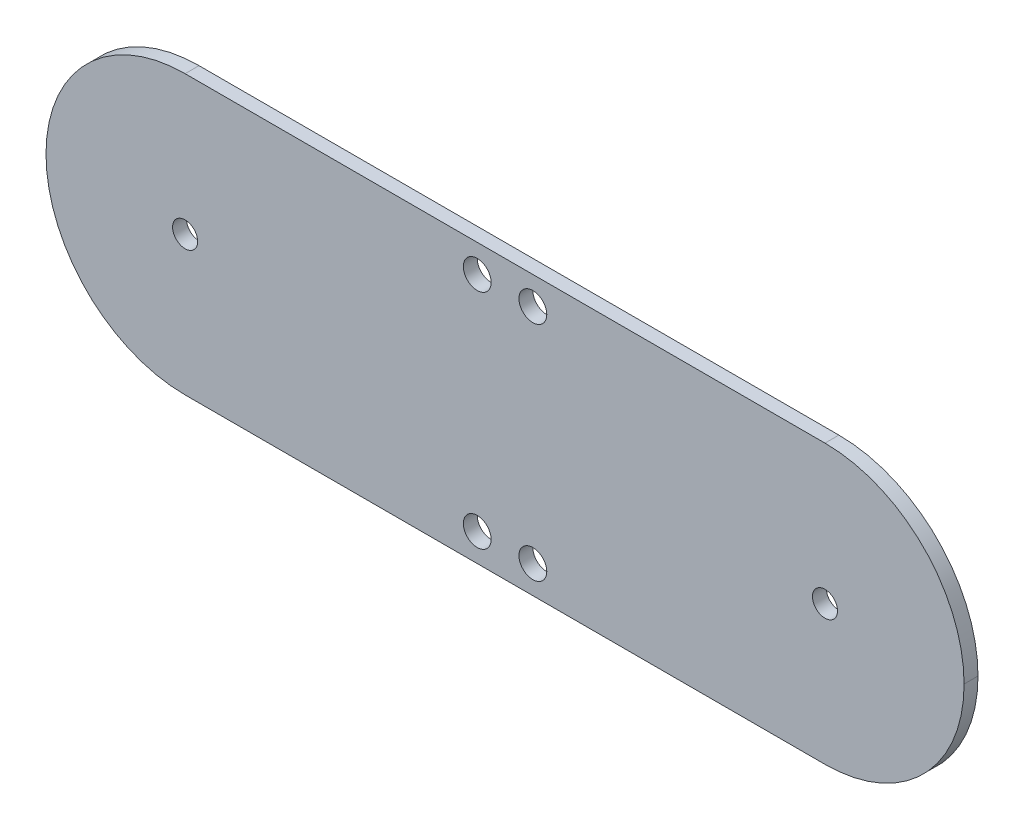
ISO-10303-21;
HEADER;
FILE_DESCRIPTION(('STEP AP214'),'2;1');
FILE_NAME('part.step','',(''),(''),'','','');
FILE_SCHEMA(('AUTOMOTIVE_DESIGN { 1 0 10303 214 1 1 1 1 }'));
ENDSEC;
DATA;
#1=APPLICATION_CONTEXT('core data for automotive mechanical design processes');
#2=APPLICATION_PROTOCOL_DEFINITION('international standard','automotive_design',2000,#1);
#3=PRODUCT_CONTEXT('',#1,'mechanical');
#4=PRODUCT('Part','Part','',(#3));
#5=PRODUCT_RELATED_PRODUCT_CATEGORY('part','',(#4));
#6=PRODUCT_DEFINITION_FORMATION('','',#4);
#7=PRODUCT_DEFINITION_CONTEXT('part definition',#1,'design');
#8=PRODUCT_DEFINITION('design','',#6,#7);
#9=PRODUCT_DEFINITION_SHAPE('','',#8);
#10=(LENGTH_UNIT() NAMED_UNIT(*) SI_UNIT(.MILLI.,.METRE.));
#11=(NAMED_UNIT(*) PLANE_ANGLE_UNIT() SI_UNIT($,.RADIAN.));
#12=(NAMED_UNIT(*) SI_UNIT($,.STERADIAN.) SOLID_ANGLE_UNIT());
#13=UNCERTAINTY_MEASURE_WITH_UNIT(LENGTH_MEASURE(1.E-05),#10,'distance_accuracy_value','');
#14=(GEOMETRIC_REPRESENTATION_CONTEXT(3) GLOBAL_UNCERTAINTY_ASSIGNED_CONTEXT((#13)) GLOBAL_UNIT_ASSIGNED_CONTEXT((#10,
#11,#12)) REPRESENTATION_CONTEXT('',''));
#15=CARTESIAN_POINT('',(0.,0.,0.));
#16=DIRECTION('',(0.,0.,1.));
#17=DIRECTION('',(1.,0.,0.));
#18=AXIS2_PLACEMENT_3D('',#15,#16,#17);
#19=CARTESIAN_POINT('',(82.5,-25.,2.5));
#20=DIRECTION('',(0.,1.,0.));
#21=DIRECTION('',(-1.,0.,0.));
#22=AXIS2_PLACEMENT_3D('',#19,#20,#21);
#23=PLANE('',#22);
#24=DIRECTION('',(1.,0.,0.));
#25=VECTOR('',#24,1.);
#26=CARTESIAN_POINT('',(82.5,-25.,2.5));
#27=LINE('',#26,#25);
#28=CARTESIAN_POINT('',(-57.5,-25.,2.5));
#29=VERTEX_POINT('',#28);
#30=CARTESIAN_POINT('',(57.5,-25.,2.5));
#31=VERTEX_POINT('',#30);
#32=EDGE_CURVE('E116',#29,#31,#27,.T.);
#33=ORIENTED_EDGE('',*,*,#32,.F.);
#34=DIRECTION('',(0.,0.,-1.));
#35=VECTOR('',#34,1.);
#36=CARTESIAN_POINT('',(-57.5,-25.,2.5));
#37=LINE('',#36,#35);
#38=CARTESIAN_POINT('',(-57.5,-25.,0.));
#39=VERTEX_POINT('',#38);
#40=EDGE_CURVE('E100',#29,#39,#37,.T.);
#41=ORIENTED_EDGE('',*,*,#40,.T.);
#42=DIRECTION('',(1.,0.,0.));
#43=VECTOR('',#42,1.);
#44=CARTESIAN_POINT('',(82.5,-25.,0.));
#45=LINE('',#44,#43);
#46=CARTESIAN_POINT('',(57.5,-25.,0.));
#47=VERTEX_POINT('',#46);
#48=EDGE_CURVE('E113',#39,#47,#45,.T.);
#49=ORIENTED_EDGE('',*,*,#48,.T.);
#50=DIRECTION('',(0.,0.,-1.));
#51=VECTOR('',#50,1.);
#52=CARTESIAN_POINT('',(57.5,-25.,2.5));
#53=LINE('',#52,#51);
#54=EDGE_CURVE('E119',#47,#31,#53,.F.);
#55=ORIENTED_EDGE('',*,*,#54,.T.);
#56=EDGE_LOOP('',(#33,#41,#49,#55));
#57=FACE_BOUND('',#56,.T.);
#58=ADVANCED_FACE('F41',(#57),#23,.F.);
#59=CARTESIAN_POINT('',(82.5,25.,2.5));
#60=DIRECTION('',(0.,-1.,0.));
#61=DIRECTION('',(1.,0.,0.));
#62=AXIS2_PLACEMENT_3D('',#59,#60,#61);
#63=PLANE('',#62);
#64=DIRECTION('',(-1.,0.,0.));
#65=VECTOR('',#64,1.);
#66=CARTESIAN_POINT('',(82.5,25.,0.));
#67=LINE('',#66,#65);
#68=CARTESIAN_POINT('',(57.5,25.,0.));
#69=VERTEX_POINT('',#68);
#70=CARTESIAN_POINT('',(-57.5,25.,0.));
#71=VERTEX_POINT('',#70);
#72=EDGE_CURVE('E125',#69,#71,#67,.T.);
#73=ORIENTED_EDGE('',*,*,#72,.T.);
#74=DIRECTION('',(0.,0.,-1.));
#75=VECTOR('',#74,1.);
#76=CARTESIAN_POINT('',(-57.5,25.,2.5));
#77=LINE('',#76,#75);
#78=CARTESIAN_POINT('',(-57.5,25.,2.5));
#79=VERTEX_POINT('',#78);
#80=EDGE_CURVE('E12',#71,#79,#77,.F.);
#81=ORIENTED_EDGE('',*,*,#80,.T.);
#82=DIRECTION('',(-1.,0.,0.));
#83=VECTOR('',#82,1.);
#84=CARTESIAN_POINT('',(82.5,25.,2.5));
#85=LINE('',#84,#83);
#86=CARTESIAN_POINT('',(57.5,25.,2.5));
#87=VERTEX_POINT('',#86);
#88=EDGE_CURVE('E133',#87,#79,#85,.T.);
#89=ORIENTED_EDGE('',*,*,#88,.F.);
#90=DIRECTION('',(0.,0.,-1.));
#91=VECTOR('',#90,1.);
#92=CARTESIAN_POINT('',(57.5,25.,2.5));
#93=LINE('',#92,#91);
#94=EDGE_CURVE('E51',#87,#69,#93,.T.);
#95=ORIENTED_EDGE('',*,*,#94,.T.);
#96=EDGE_LOOP('',(#73,#81,#89,#95));
#97=FACE_BOUND('',#96,.T.);
#98=ADVANCED_FACE('F215',(#97),#63,.F.);
#99=CARTESIAN_POINT('',(0.,0.,2.5));
#100=DIRECTION('',(0.,0.,-1.));
#101=DIRECTION('',(-1.,0.,0.));
#102=AXIS2_PLACEMENT_3D('',#99,#100,#101);
#103=PLANE('',#102);
#104=CARTESIAN_POINT('',(57.5,0.,2.5));
#105=DIRECTION('',(0.,0.,-1.));
#106=DIRECTION('',(-1.,0.,0.));
#107=AXIS2_PLACEMENT_3D('',#104,#105,#106);
#108=CIRCLE('',#107,2.25);
#109=CARTESIAN_POINT('',(55.25,0.,2.5));
#110=VERTEX_POINT('',#109);
#111=EDGE_CURVE('E178',#110,#110,#108,.T.);
#112=ORIENTED_EDGE('',*,*,#111,.T.);
#113=EDGE_LOOP('',(#112));
#114=FACE_BOUND('',#113,.T.);
#115=CARTESIAN_POINT('',(-57.5,0.,2.5));
#116=DIRECTION('',(0.,0.,1.));
#117=DIRECTION('',(1.,0.,0.));
#118=AXIS2_PLACEMENT_3D('',#115,#116,#117);
#119=CIRCLE('',#118,2.25);
#120=CARTESIAN_POINT('',(-55.25,0.,2.5));
#121=VERTEX_POINT('',#120);
#122=EDGE_CURVE('E164',#121,#121,#119,.T.);
#123=ORIENTED_EDGE('',*,*,#122,.F.);
#124=EDGE_LOOP('',(#123));
#125=FACE_BOUND('',#124,.T.);
#126=CARTESIAN_POINT('',(-5.,-20.,2.5));
#127=DIRECTION('',(0.,0.,-1.));
#128=DIRECTION('',(1.,0.,0.));
#129=AXIS2_PLACEMENT_3D('',#126,#127,#128);
#130=CIRCLE('',#129,2.5);
#131=CARTESIAN_POINT('',(-2.5,-20.,2.5));
#132=VERTEX_POINT('',#131);
#133=EDGE_CURVE('E186',#132,#132,#130,.T.);
#134=ORIENTED_EDGE('',*,*,#133,.T.);
#135=EDGE_LOOP('',(#134));
#136=FACE_BOUND('',#135,.T.);
#137=CARTESIAN_POINT('',(5.,-20.,2.5));
#138=DIRECTION('',(0.,0.,-1.));
#139=DIRECTION('',(1.,0.,0.));
#140=AXIS2_PLACEMENT_3D('',#137,#138,#139);
#141=CIRCLE('',#140,2.5);
#142=CARTESIAN_POINT('',(7.5,-20.,2.5));
#143=VERTEX_POINT('',#142);
#144=EDGE_CURVE('E163',#143,#143,#141,.T.);
#145=ORIENTED_EDGE('',*,*,#144,.T.);
#146=EDGE_LOOP('',(#145));
#147=FACE_BOUND('',#146,.T.);
#148=CARTESIAN_POINT('',(-5.,20.,2.5));
#149=DIRECTION('',(0.,0.,1.));
#150=DIRECTION('',(1.,0.,0.));
#151=AXIS2_PLACEMENT_3D('',#148,#149,#150);
#152=CIRCLE('',#151,2.5);
#153=CARTESIAN_POINT('',(-2.5,20.,2.5));
#154=VERTEX_POINT('',#153);
#155=EDGE_CURVE('E196',#154,#154,#152,.T.);
#156=ORIENTED_EDGE('',*,*,#155,.F.);
#157=EDGE_LOOP('',(#156));
#158=FACE_BOUND('',#157,.T.);
#159=CARTESIAN_POINT('',(5.,20.,2.5));
#160=DIRECTION('',(0.,0.,1.));
#161=DIRECTION('',(1.,0.,0.));
#162=AXIS2_PLACEMENT_3D('',#159,#160,#161);
#163=CIRCLE('',#162,2.5);
#164=CARTESIAN_POINT('',(7.5,20.,2.5));
#165=VERTEX_POINT('',#164);
#166=EDGE_CURVE('E185',#165,#165,#163,.T.);
#167=ORIENTED_EDGE('',*,*,#166,.F.);
#168=EDGE_LOOP('',(#167));
#169=FACE_BOUND('',#168,.T.);
#170=CARTESIAN_POINT('',(-57.5,0.,2.5));
#171=DIRECTION('',(0.,0.,-1.));
#172=DIRECTION('',(-1.,0.,0.));
#173=AXIS2_PLACEMENT_3D('',#170,#171,#172);
#174=CIRCLE('',#173,25.);
#175=CARTESIAN_POINT('',(-82.5,0.,2.5));
#176=VERTEX_POINT('',#175);
#177=EDGE_CURVE('E149',#79,#176,#174,.F.);
#178=ORIENTED_EDGE('',*,*,#177,.T.);
#179=CARTESIAN_POINT('',(-57.5,0.,2.5));
#180=DIRECTION('',(0.,0.,-1.));
#181=DIRECTION('',(-1.,0.,0.));
#182=AXIS2_PLACEMENT_3D('',#179,#180,#181);
#183=CIRCLE('',#182,25.);
#184=EDGE_CURVE('E152',#176,#29,#183,.F.);
#185=ORIENTED_EDGE('',*,*,#184,.T.);
#186=ORIENTED_EDGE('',*,*,#32,.T.);
#187=CARTESIAN_POINT('',(57.5,0.,2.5));
#188=DIRECTION('',(0.,0.,-1.));
#189=DIRECTION('',(-1.,0.,0.));
#190=AXIS2_PLACEMENT_3D('',#187,#188,#189);
#191=CIRCLE('',#190,25.);
#192=CARTESIAN_POINT('',(82.5,0.,2.5));
#193=VERTEX_POINT('',#192);
#194=EDGE_CURVE('E146',#31,#193,#191,.F.);
#195=ORIENTED_EDGE('',*,*,#194,.T.);
#196=CARTESIAN_POINT('',(57.5,0.,2.5));
#197=DIRECTION('',(0.,0.,-1.));
#198=DIRECTION('',(-1.,0.,0.));
#199=AXIS2_PLACEMENT_3D('',#196,#197,#198);
#200=CIRCLE('',#199,25.);
#201=EDGE_CURVE('E64',#193,#87,#200,.F.);
#202=ORIENTED_EDGE('',*,*,#201,.T.);
#203=ORIENTED_EDGE('',*,*,#88,.T.);
#204=EDGE_LOOP('',(#178,#185,#186,#195,#202,#203));
#205=FACE_BOUND('',#204,.T.);
#206=ADVANCED_FACE('F209',(#114,#125,#136,#147,#158,#169,#205),#103,.F.);
#207=CARTESIAN_POINT('',(0.,0.,0.));
#208=DIRECTION('',(0.,0.,-1.));
#209=DIRECTION('',(-1.,0.,0.));
#210=AXIS2_PLACEMENT_3D('',#207,#208,#209);
#211=PLANE('',#210);
#212=CARTESIAN_POINT('',(57.5,0.,0.));
#213=DIRECTION('',(0.,0.,-1.));
#214=DIRECTION('',(-1.,0.,0.));
#215=AXIS2_PLACEMENT_3D('',#212,#213,#214);
#216=CIRCLE('',#215,2.25);
#217=CARTESIAN_POINT('',(55.25,0.,0.));
#218=VERTEX_POINT('',#217);
#219=EDGE_CURVE('E45',#218,#218,#216,.F.);
#220=ORIENTED_EDGE('',*,*,#219,.T.);
#221=EDGE_LOOP('',(#220));
#222=FACE_BOUND('',#221,.T.);
#223=CARTESIAN_POINT('',(-57.5,0.,0.));
#224=DIRECTION('',(0.,0.,-1.));
#225=DIRECTION('',(-1.,0.,0.));
#226=AXIS2_PLACEMENT_3D('',#223,#224,#225);
#227=CIRCLE('',#226,2.25);
#228=CARTESIAN_POINT('',(-59.75,0.,0.));
#229=VERTEX_POINT('',#228);
#230=EDGE_CURVE('E160',#229,#229,#227,.T.);
#231=ORIENTED_EDGE('',*,*,#230,.F.);
#232=EDGE_LOOP('',(#231));
#233=FACE_BOUND('',#232,.T.);
#234=CARTESIAN_POINT('',(-5.,-20.,0.));
#235=DIRECTION('',(0.,0.,-1.));
#236=DIRECTION('',(1.,0.,0.));
#237=AXIS2_PLACEMENT_3D('',#234,#235,#236);
#238=CIRCLE('',#237,2.5);
#239=CARTESIAN_POINT('',(-2.5,-20.,0.));
#240=VERTEX_POINT('',#239);
#241=EDGE_CURVE('E181',#240,#240,#238,.T.);
#242=ORIENTED_EDGE('',*,*,#241,.F.);
#243=EDGE_LOOP('',(#242));
#244=FACE_BOUND('',#243,.T.);
#245=CARTESIAN_POINT('',(5.,-20.,0.));
#246=DIRECTION('',(0.,0.,-1.));
#247=DIRECTION('',(1.,0.,0.));
#248=AXIS2_PLACEMENT_3D('',#245,#246,#247);
#249=CIRCLE('',#248,2.5);
#250=CARTESIAN_POINT('',(7.5,-20.,0.));
#251=VERTEX_POINT('',#250);
#252=EDGE_CURVE('E170',#251,#251,#249,.T.);
#253=ORIENTED_EDGE('',*,*,#252,.F.);
#254=EDGE_LOOP('',(#253));
#255=FACE_BOUND('',#254,.T.);
#256=CARTESIAN_POINT('',(-5.,20.,0.));
#257=DIRECTION('',(0.,0.,1.));
#258=DIRECTION('',(1.,0.,0.));
#259=AXIS2_PLACEMENT_3D('',#256,#257,#258);
#260=CIRCLE('',#259,2.5);
#261=CARTESIAN_POINT('',(-2.5,20.,0.));
#262=VERTEX_POINT('',#261);
#263=EDGE_CURVE('E159',#262,#262,#260,.T.);
#264=ORIENTED_EDGE('',*,*,#263,.T.);
#265=EDGE_LOOP('',(#264));
#266=FACE_BOUND('',#265,.T.);
#267=CARTESIAN_POINT('',(5.,20.,0.));
#268=DIRECTION('',(0.,0.,1.));
#269=DIRECTION('',(1.,0.,0.));
#270=AXIS2_PLACEMENT_3D('',#267,#268,#269);
#271=CIRCLE('',#270,2.5);
#272=CARTESIAN_POINT('',(7.5,20.,0.));
#273=VERTEX_POINT('',#272);
#274=EDGE_CURVE('E200',#273,#273,#271,.T.);
#275=ORIENTED_EDGE('',*,*,#274,.T.);
#276=EDGE_LOOP('',(#275));
#277=FACE_BOUND('',#276,.T.);
#278=ORIENTED_EDGE('',*,*,#48,.F.);
#279=CARTESIAN_POINT('',(-57.5,0.,0.));
#280=DIRECTION('',(0.,0.,-1.));
#281=DIRECTION('',(-1.,0.,0.));
#282=AXIS2_PLACEMENT_3D('',#279,#280,#281);
#283=CIRCLE('',#282,25.);
#284=CARTESIAN_POINT('',(-82.5,0.,0.));
#285=VERTEX_POINT('',#284);
#286=EDGE_CURVE('E96',#39,#285,#283,.T.);
#287=ORIENTED_EDGE('',*,*,#286,.T.);
#288=CARTESIAN_POINT('',(-57.5,0.,0.));
#289=DIRECTION('',(0.,0.,-1.));
#290=DIRECTION('',(-1.,0.,0.));
#291=AXIS2_PLACEMENT_3D('',#288,#289,#290);
#292=CIRCLE('',#291,25.);
#293=EDGE_CURVE('E107',#285,#71,#292,.T.);
#294=ORIENTED_EDGE('',*,*,#293,.T.);
#295=ORIENTED_EDGE('',*,*,#72,.F.);
#296=CARTESIAN_POINT('',(57.5,0.,0.));
#297=DIRECTION('',(0.,0.,-1.));
#298=DIRECTION('',(-1.,0.,0.));
#299=AXIS2_PLACEMENT_3D('',#296,#297,#298);
#300=CIRCLE('',#299,25.);
#301=CARTESIAN_POINT('',(82.5,0.,0.));
#302=VERTEX_POINT('',#301);
#303=EDGE_CURVE('E118',#69,#302,#300,.T.);
#304=ORIENTED_EDGE('',*,*,#303,.T.);
#305=CARTESIAN_POINT('',(57.5,0.,0.));
#306=DIRECTION('',(0.,0.,-1.));
#307=DIRECTION('',(-1.,0.,0.));
#308=AXIS2_PLACEMENT_3D('',#305,#306,#307);
#309=CIRCLE('',#308,25.);
#310=EDGE_CURVE('E123',#302,#47,#309,.T.);
#311=ORIENTED_EDGE('',*,*,#310,.T.);
#312=EDGE_LOOP('',(#278,#287,#294,#295,#304,#311));
#313=FACE_BOUND('',#312,.T.);
#314=ADVANCED_FACE('F121',(#222,#233,#244,#255,#266,#277,#313),#211,.T.);
#315=CARTESIAN_POINT('',(-57.5,0.,2.5));
#316=DIRECTION('',(0.,0.,-1.));
#317=DIRECTION('',(-1.,0.,0.));
#318=AXIS2_PLACEMENT_3D('',#315,#316,#317);
#319=CYLINDRICAL_SURFACE('',#318,25.);
#320=DIRECTION('',(0.,0.,-1.));
#321=VECTOR('',#320,1.);
#322=CARTESIAN_POINT('',(-82.5,0.,2.5));
#323=LINE('',#322,#321);
#324=EDGE_CURVE('E102',#176,#285,#323,.T.);
#325=ORIENTED_EDGE('',*,*,#324,.F.);
#326=ORIENTED_EDGE('',*,*,#177,.F.);
#327=ORIENTED_EDGE('',*,*,#80,.F.);
#328=ORIENTED_EDGE('',*,*,#293,.F.);
#329=EDGE_LOOP('',(#325,#326,#327,#328));
#330=FACE_BOUND('',#329,.T.);
#331=ADVANCED_FACE('F212',(#330),#319,.T.);
#332=CARTESIAN_POINT('',(-57.5,0.,2.5));
#333=DIRECTION('',(0.,0.,-1.));
#334=DIRECTION('',(-1.,0.,0.));
#335=AXIS2_PLACEMENT_3D('',#332,#333,#334);
#336=CYLINDRICAL_SURFACE('',#335,25.);
#337=ORIENTED_EDGE('',*,*,#184,.F.);
#338=ORIENTED_EDGE('',*,*,#324,.T.);
#339=ORIENTED_EDGE('',*,*,#286,.F.);
#340=ORIENTED_EDGE('',*,*,#40,.F.);
#341=EDGE_LOOP('',(#337,#338,#339,#340));
#342=FACE_BOUND('',#341,.T.);
#343=ADVANCED_FACE('F99',(#342),#336,.T.);
#344=CARTESIAN_POINT('',(57.5,0.,2.5));
#345=DIRECTION('',(0.,0.,-1.));
#346=DIRECTION('',(-1.,0.,0.));
#347=AXIS2_PLACEMENT_3D('',#344,#345,#346);
#348=CYLINDRICAL_SURFACE('',#347,25.);
#349=ORIENTED_EDGE('',*,*,#94,.F.);
#350=ORIENTED_EDGE('',*,*,#201,.F.);
#351=DIRECTION('',(0.,0.,-1.));
#352=VECTOR('',#351,1.);
#353=CARTESIAN_POINT('',(82.5,0.,2.5));
#354=LINE('',#353,#352);
#355=EDGE_CURVE('E130',#302,#193,#354,.F.);
#356=ORIENTED_EDGE('',*,*,#355,.F.);
#357=ORIENTED_EDGE('',*,*,#303,.F.);
#358=EDGE_LOOP('',(#349,#350,#356,#357));
#359=FACE_BOUND('',#358,.T.);
#360=ADVANCED_FACE('F43',(#359),#348,.T.);
#361=CARTESIAN_POINT('',(57.5,0.,2.5));
#362=DIRECTION('',(0.,0.,-1.));
#363=DIRECTION('',(-1.,0.,0.));
#364=AXIS2_PLACEMENT_3D('',#361,#362,#363);
#365=CYLINDRICAL_SURFACE('',#364,25.);
#366=ORIENTED_EDGE('',*,*,#194,.F.);
#367=ORIENTED_EDGE('',*,*,#54,.F.);
#368=ORIENTED_EDGE('',*,*,#310,.F.);
#369=ORIENTED_EDGE('',*,*,#355,.T.);
#370=EDGE_LOOP('',(#366,#367,#368,#369));
#371=FACE_BOUND('',#370,.T.);
#372=ADVANCED_FACE('F219',(#371),#365,.T.);
#373=CARTESIAN_POINT('',(5.,20.,0.));
#374=DIRECTION('',(0.,0.,1.));
#375=DIRECTION('',(1.,0.,0.));
#376=AXIS2_PLACEMENT_3D('',#373,#374,#375);
#377=CYLINDRICAL_SURFACE('',#376,2.5);
#378=ORIENTED_EDGE('',*,*,#274,.F.);
#379=EDGE_LOOP('',(#378));
#380=FACE_BOUND('',#379,.T.);
#381=ORIENTED_EDGE('',*,*,#166,.T.);
#382=EDGE_LOOP('',(#381));
#383=FACE_BOUND('',#382,.T.);
#384=ADVANCED_FACE('F221',(#380,#383),#377,.F.);
#385=CARTESIAN_POINT('',(-5.,20.,0.));
#386=DIRECTION('',(0.,0.,1.));
#387=DIRECTION('',(1.,0.,0.));
#388=AXIS2_PLACEMENT_3D('',#385,#386,#387);
#389=CYLINDRICAL_SURFACE('',#388,2.5);
#390=ORIENTED_EDGE('',*,*,#263,.F.);
#391=EDGE_LOOP('',(#390));
#392=FACE_BOUND('',#391,.T.);
#393=ORIENTED_EDGE('',*,*,#155,.T.);
#394=EDGE_LOOP('',(#393));
#395=FACE_BOUND('',#394,.T.);
#396=ADVANCED_FACE('F226',(#392,#395),#389,.F.);
#397=CARTESIAN_POINT('',(5.,-20.,0.));
#398=DIRECTION('',(0.,0.,1.));
#399=DIRECTION('',(1.,0.,0.));
#400=AXIS2_PLACEMENT_3D('',#397,#398,#399);
#401=CYLINDRICAL_SURFACE('',#400,2.5);
#402=ORIENTED_EDGE('',*,*,#252,.T.);
#403=EDGE_LOOP('',(#402));
#404=FACE_BOUND('',#403,.T.);
#405=ORIENTED_EDGE('',*,*,#144,.F.);
#406=EDGE_LOOP('',(#405));
#407=FACE_BOUND('',#406,.T.);
#408=ADVANCED_FACE('F253',(#404,#407),#401,.F.);
#409=CARTESIAN_POINT('',(-5.,-20.,0.));
#410=DIRECTION('',(0.,0.,1.));
#411=DIRECTION('',(1.,0.,0.));
#412=AXIS2_PLACEMENT_3D('',#409,#410,#411);
#413=CYLINDRICAL_SURFACE('',#412,2.5);
#414=ORIENTED_EDGE('',*,*,#241,.T.);
#415=EDGE_LOOP('',(#414));
#416=FACE_BOUND('',#415,.T.);
#417=ORIENTED_EDGE('',*,*,#133,.F.);
#418=EDGE_LOOP('',(#417));
#419=FACE_BOUND('',#418,.T.);
#420=ADVANCED_FACE('F257',(#416,#419),#413,.F.);
#421=CARTESIAN_POINT('',(-57.5,0.,-7.5));
#422=DIRECTION('',(0.,0.,1.));
#423=DIRECTION('',(1.,0.,0.));
#424=AXIS2_PLACEMENT_3D('',#421,#422,#423);
#425=CYLINDRICAL_SURFACE('',#424,2.25);
#426=ORIENTED_EDGE('',*,*,#230,.T.);
#427=EDGE_LOOP('',(#426));
#428=FACE_BOUND('',#427,.T.);
#429=ORIENTED_EDGE('',*,*,#122,.T.);
#430=EDGE_LOOP('',(#429));
#431=FACE_BOUND('',#430,.T.);
#432=ADVANCED_FACE('F261',(#428,#431),#425,.F.);
#433=CARTESIAN_POINT('',(57.5,0.,-7.5));
#434=DIRECTION('',(0.,0.,1.));
#435=DIRECTION('',(1.,0.,0.));
#436=AXIS2_PLACEMENT_3D('',#433,#434,#435);
#437=CYLINDRICAL_SURFACE('',#436,2.25);
#438=ORIENTED_EDGE('',*,*,#219,.F.);
#439=EDGE_LOOP('',(#438));
#440=FACE_BOUND('',#439,.T.);
#441=ORIENTED_EDGE('',*,*,#111,.F.);
#442=EDGE_LOOP('',(#441));
#443=FACE_BOUND('',#442,.T.);
#444=ADVANCED_FACE('F265',(#440,#443),#437,.F.);
#445=CLOSED_SHELL('',(#58,#98,#206,#314,#331,#343,#360,#372,#384,#396,#408,#420,#432,#444));
#446=MANIFOLD_SOLID_BREP('B2',#445);
#447=ADVANCED_BREP_SHAPE_REPRESENTATION('',(#18,#446),#14);
#448=SHAPE_DEFINITION_REPRESENTATION(#9,#447);
ENDSEC;
END-ISO-10303-21;
